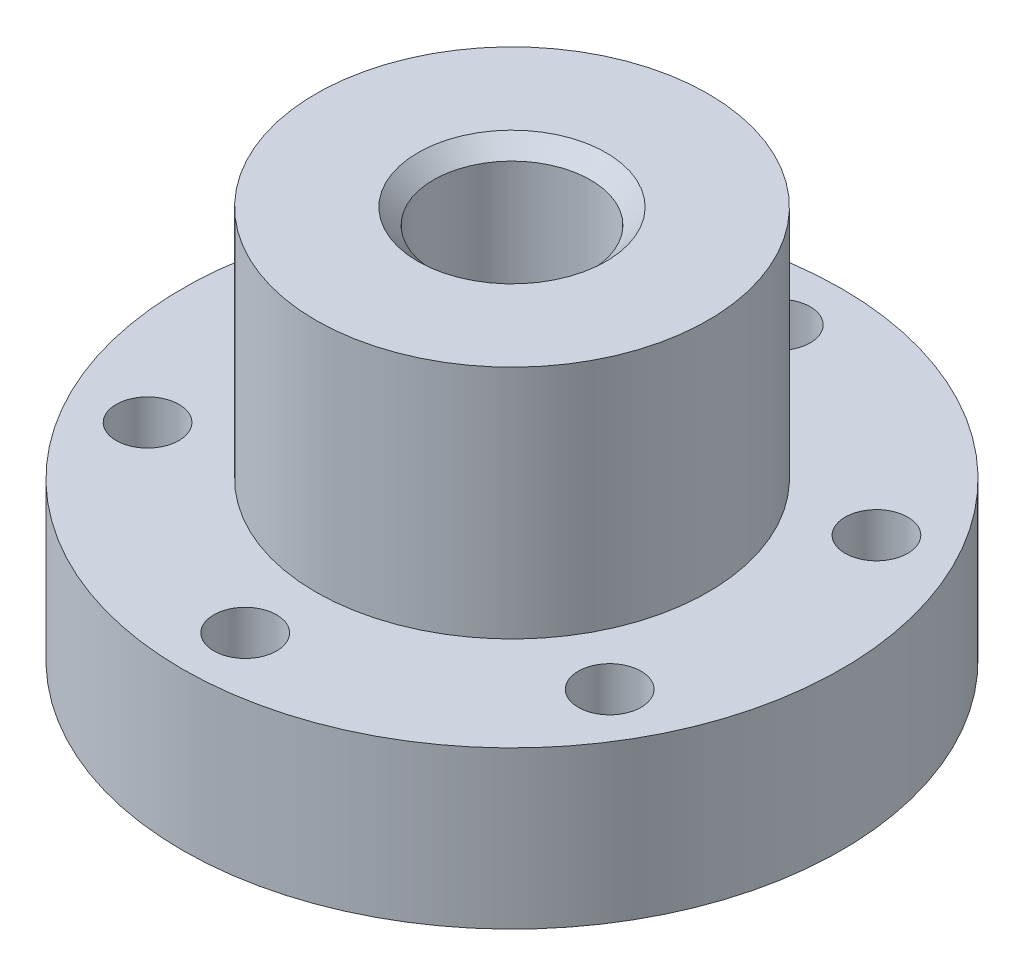
ISO-10303-21;
HEADER;
FILE_DESCRIPTION(('STEP AP214'),'2;1');
FILE_NAME('part.step','',(''),(''),'','','');
FILE_SCHEMA(('AUTOMOTIVE_DESIGN { 1 0 10303 214 1 1 1 1 }'));
ENDSEC;
DATA;
#1=APPLICATION_CONTEXT('core data for automotive mechanical design processes');
#2=APPLICATION_PROTOCOL_DEFINITION('international standard','automotive_design',2000,#1);
#3=PRODUCT_CONTEXT('',#1,'mechanical');
#4=PRODUCT('Part','Part','',(#3));
#5=PRODUCT_RELATED_PRODUCT_CATEGORY('part','',(#4));
#6=PRODUCT_DEFINITION_FORMATION('','',#4);
#7=PRODUCT_DEFINITION_CONTEXT('part definition',#1,'design');
#8=PRODUCT_DEFINITION('design','',#6,#7);
#9=PRODUCT_DEFINITION_SHAPE('','',#8);
#10=(LENGTH_UNIT() NAMED_UNIT(*) SI_UNIT(.MILLI.,.METRE.));
#11=(NAMED_UNIT(*) PLANE_ANGLE_UNIT() SI_UNIT($,.RADIAN.));
#12=(NAMED_UNIT(*) SI_UNIT($,.STERADIAN.) SOLID_ANGLE_UNIT());
#13=UNCERTAINTY_MEASURE_WITH_UNIT(LENGTH_MEASURE(1.E-05),#10,'distance_accuracy_value','');
#14=(GEOMETRIC_REPRESENTATION_CONTEXT(3) GLOBAL_UNCERTAINTY_ASSIGNED_CONTEXT((#13)) GLOBAL_UNIT_ASSIGNED_CONTEXT((#10,
#11,#12)) REPRESENTATION_CONTEXT('',''));
#15=CARTESIAN_POINT('',(0.,0.,0.));
#16=DIRECTION('',(0.,0.,1.));
#17=DIRECTION('',(1.,0.,0.));
#18=AXIS2_PLACEMENT_3D('',#15,#16,#17);
#19=CARTESIAN_POINT('',(0.,10.,0.));
#20=DIRECTION('',(0.,1.,0.));
#21=DIRECTION('',(0.,0.,1.));
#22=AXIS2_PLACEMENT_3D('',#19,#20,#21);
#23=PLANE('',#22);
#24=CARTESIAN_POINT('',(0.,10.,0.));
#25=DIRECTION('',(0.,1.,0.));
#26=DIRECTION('',(0.,0.,1.));
#27=AXIS2_PLACEMENT_3D('',#24,#25,#26);
#28=CIRCLE('',#27,12.5);
#29=CARTESIAN_POINT('',(0.,10.,12.5));
#30=VERTEX_POINT('',#29);
#31=EDGE_CURVE('E121',#30,#30,#28,.T.);
#32=ORIENTED_EDGE('',*,*,#31,.F.);
#33=EDGE_LOOP('',(#32));
#34=FACE_BOUND('',#33,.T.);
#35=CARTESIAN_POINT('',(-14.7224318643355,10.,8.50000000000001));
#36=DIRECTION('',(0.,1.,0.));
#37=DIRECTION('',(0.,0.,1.));
#38=AXIS2_PLACEMENT_3D('',#35,#36,#37);
#39=CIRCLE('',#38,2.);
#40=CARTESIAN_POINT('',(-14.7224318643355,10.,10.5));
#41=VERTEX_POINT('',#40);
#42=EDGE_CURVE('E101',#41,#41,#39,.T.);
#43=ORIENTED_EDGE('',*,*,#42,.F.);
#44=EDGE_LOOP('',(#43));
#45=FACE_BOUND('',#44,.T.);
#46=CARTESIAN_POINT('',(14.7224318643355,10.,8.5));
#47=DIRECTION('',(0.,1.,0.));
#48=DIRECTION('',(0.,0.,1.));
#49=AXIS2_PLACEMENT_3D('',#46,#47,#48);
#50=CIRCLE('',#49,2.);
#51=CARTESIAN_POINT('',(14.7224318643355,10.,10.5));
#52=VERTEX_POINT('',#51);
#53=EDGE_CURVE('E85',#52,#52,#50,.T.);
#54=ORIENTED_EDGE('',*,*,#53,.F.);
#55=EDGE_LOOP('',(#54));
#56=FACE_BOUND('',#55,.T.);
#57=CARTESIAN_POINT('',(0.,10.,-17.));
#58=DIRECTION('',(0.,1.,0.));
#59=DIRECTION('',(0.,0.,1.));
#60=AXIS2_PLACEMENT_3D('',#57,#58,#59);
#61=CIRCLE('',#60,2.);
#62=CARTESIAN_POINT('',(0.,10.,-15.));
#63=VERTEX_POINT('',#62);
#64=EDGE_CURVE('E69',#63,#63,#61,.T.);
#65=ORIENTED_EDGE('',*,*,#64,.F.);
#66=EDGE_LOOP('',(#65));
#67=FACE_BOUND('',#66,.T.);
#68=CARTESIAN_POINT('',(0.,10.,0.));
#69=DIRECTION('',(0.,1.,0.));
#70=DIRECTION('',(0.,0.,1.));
#71=AXIS2_PLACEMENT_3D('',#68,#69,#70);
#72=CIRCLE('',#71,21.);
#73=CARTESIAN_POINT('',(0.,10.,21.));
#74=VERTEX_POINT('',#73);
#75=EDGE_CURVE('E64',#74,#74,#72,.T.);
#76=ORIENTED_EDGE('',*,*,#75,.T.);
#77=EDGE_LOOP('',(#76));
#78=FACE_BOUND('',#77,.T.);
#79=CARTESIAN_POINT('',(14.7224318643355,10.,-8.5));
#80=DIRECTION('',(0.,1.,0.));
#81=DIRECTION('',(0.,0.,1.));
#82=AXIS2_PLACEMENT_3D('',#79,#80,#81);
#83=CIRCLE('',#82,2.);
#84=CARTESIAN_POINT('',(14.7224318643355,10.,-6.5));
#85=VERTEX_POINT('',#84);
#86=EDGE_CURVE('E77',#85,#85,#83,.T.);
#87=ORIENTED_EDGE('',*,*,#86,.F.);
#88=EDGE_LOOP('',(#87));
#89=FACE_BOUND('',#88,.T.);
#90=CARTESIAN_POINT('',(0.,10.,17.));
#91=DIRECTION('',(0.,1.,0.));
#92=DIRECTION('',(0.,0.,1.));
#93=AXIS2_PLACEMENT_3D('',#90,#91,#92);
#94=CIRCLE('',#93,2.);
#95=CARTESIAN_POINT('',(0.,10.,19.));
#96=VERTEX_POINT('',#95);
#97=EDGE_CURVE('E93',#96,#96,#94,.T.);
#98=ORIENTED_EDGE('',*,*,#97,.F.);
#99=EDGE_LOOP('',(#98));
#100=FACE_BOUND('',#99,.T.);
#101=CARTESIAN_POINT('',(-14.7224318643355,10.,-8.49999999999999));
#102=DIRECTION('',(0.,1.,0.));
#103=DIRECTION('',(0.,0.,1.));
#104=AXIS2_PLACEMENT_3D('',#101,#102,#103);
#105=CIRCLE('',#104,2.);
#106=CARTESIAN_POINT('',(-14.7224318643355,10.,-6.49999999999999));
#107=VERTEX_POINT('',#106);
#108=EDGE_CURVE('E109',#107,#107,#105,.T.);
#109=ORIENTED_EDGE('',*,*,#108,.F.);
#110=EDGE_LOOP('',(#109));
#111=FACE_BOUND('',#110,.T.);
#112=ADVANCED_FACE('F39',(#34,#45,#56,#67,#78,#89,#100,#111),#23,.T.);
#113=CARTESIAN_POINT('',(0.,0.,0.));
#114=DIRECTION('',(0.,1.,0.));
#115=DIRECTION('',(0.,0.,1.));
#116=AXIS2_PLACEMENT_3D('',#113,#114,#115);
#117=PLANE('',#116);
#118=CARTESIAN_POINT('',(0.,0.,0.));
#119=DIRECTION('',(0.,1.,0.));
#120=DIRECTION('',(0.,0.,1.));
#121=AXIS2_PLACEMENT_3D('',#118,#119,#120);
#122=CIRCLE('',#121,6.);
#123=CARTESIAN_POINT('',(0.,0.,6.));
#124=VERTEX_POINT('',#123);
#125=EDGE_CURVE('E58',#124,#124,#122,.T.);
#126=ORIENTED_EDGE('',*,*,#125,.T.);
#127=EDGE_LOOP('',(#126));
#128=FACE_BOUND('',#127,.T.);
#129=CARTESIAN_POINT('',(0.,0.,0.));
#130=DIRECTION('',(0.,1.,0.));
#131=DIRECTION('',(0.,0.,1.));
#132=AXIS2_PLACEMENT_3D('',#129,#130,#131);
#133=CIRCLE('',#132,21.);
#134=CARTESIAN_POINT('',(0.,0.,21.));
#135=VERTEX_POINT('',#134);
#136=EDGE_CURVE('E65',#135,#135,#133,.T.);
#137=ORIENTED_EDGE('',*,*,#136,.F.);
#138=EDGE_LOOP('',(#137));
#139=FACE_BOUND('',#138,.T.);
#140=CARTESIAN_POINT('',(0.,0.,-17.));
#141=DIRECTION('',(0.,1.,0.));
#142=DIRECTION('',(0.,0.,1.));
#143=AXIS2_PLACEMENT_3D('',#140,#141,#142);
#144=CIRCLE('',#143,2.);
#145=CARTESIAN_POINT('',(0.,0.,-15.));
#146=VERTEX_POINT('',#145);
#147=EDGE_CURVE('E73',#146,#146,#144,.T.);
#148=ORIENTED_EDGE('',*,*,#147,.T.);
#149=EDGE_LOOP('',(#148));
#150=FACE_BOUND('',#149,.T.);
#151=CARTESIAN_POINT('',(14.7224318643355,0.,-8.5));
#152=DIRECTION('',(0.,1.,0.));
#153=DIRECTION('',(0.,0.,1.));
#154=AXIS2_PLACEMENT_3D('',#151,#152,#153);
#155=CIRCLE('',#154,2.);
#156=CARTESIAN_POINT('',(14.7224318643355,0.,-6.5));
#157=VERTEX_POINT('',#156);
#158=EDGE_CURVE('E81',#157,#157,#155,.T.);
#159=ORIENTED_EDGE('',*,*,#158,.T.);
#160=EDGE_LOOP('',(#159));
#161=FACE_BOUND('',#160,.T.);
#162=CARTESIAN_POINT('',(14.7224318643355,0.,8.5));
#163=DIRECTION('',(0.,1.,0.));
#164=DIRECTION('',(0.,0.,1.));
#165=AXIS2_PLACEMENT_3D('',#162,#163,#164);
#166=CIRCLE('',#165,2.);
#167=CARTESIAN_POINT('',(14.7224318643355,0.,10.5));
#168=VERTEX_POINT('',#167);
#169=EDGE_CURVE('E89',#168,#168,#166,.T.);
#170=ORIENTED_EDGE('',*,*,#169,.T.);
#171=EDGE_LOOP('',(#170));
#172=FACE_BOUND('',#171,.T.);
#173=CARTESIAN_POINT('',(0.,0.,17.));
#174=DIRECTION('',(0.,1.,0.));
#175=DIRECTION('',(0.,0.,1.));
#176=AXIS2_PLACEMENT_3D('',#173,#174,#175);
#177=CIRCLE('',#176,2.);
#178=CARTESIAN_POINT('',(0.,0.,19.));
#179=VERTEX_POINT('',#178);
#180=EDGE_CURVE('E97',#179,#179,#177,.T.);
#181=ORIENTED_EDGE('',*,*,#180,.T.);
#182=EDGE_LOOP('',(#181));
#183=FACE_BOUND('',#182,.T.);
#184=CARTESIAN_POINT('',(-14.7224318643355,0.,8.50000000000001));
#185=DIRECTION('',(0.,1.,0.));
#186=DIRECTION('',(0.,0.,1.));
#187=AXIS2_PLACEMENT_3D('',#184,#185,#186);
#188=CIRCLE('',#187,2.);
#189=CARTESIAN_POINT('',(-14.7224318643355,0.,10.5));
#190=VERTEX_POINT('',#189);
#191=EDGE_CURVE('E105',#190,#190,#188,.T.);
#192=ORIENTED_EDGE('',*,*,#191,.T.);
#193=EDGE_LOOP('',(#192));
#194=FACE_BOUND('',#193,.T.);
#195=CARTESIAN_POINT('',(-14.7224318643355,0.,-8.49999999999999));
#196=DIRECTION('',(0.,1.,0.));
#197=DIRECTION('',(0.,0.,1.));
#198=AXIS2_PLACEMENT_3D('',#195,#196,#197);
#199=CIRCLE('',#198,2.);
#200=CARTESIAN_POINT('',(-14.7224318643355,0.,-6.49999999999999));
#201=VERTEX_POINT('',#200);
#202=EDGE_CURVE('E113',#201,#201,#199,.T.);
#203=ORIENTED_EDGE('',*,*,#202,.T.);
#204=EDGE_LOOP('',(#203));
#205=FACE_BOUND('',#204,.T.);
#206=ADVANCED_FACE('F140',(#128,#139,#150,#161,#172,#183,#194,#205),#117,.F.);
#207=CARTESIAN_POINT('',(0.,10.,0.));
#208=DIRECTION('',(0.,-1.,0.));
#209=DIRECTION('',(0.,0.,-1.));
#210=AXIS2_PLACEMENT_3D('',#207,#208,#209);
#211=CYLINDRICAL_SURFACE('',#210,21.);
#212=ORIENTED_EDGE('',*,*,#75,.F.);
#213=EDGE_LOOP('',(#212));
#214=FACE_BOUND('',#213,.T.);
#215=ORIENTED_EDGE('',*,*,#136,.T.);
#216=EDGE_LOOP('',(#215));
#217=FACE_BOUND('',#216,.T.);
#218=ADVANCED_FACE('F163',(#214,#217),#211,.T.);
#219=CARTESIAN_POINT('',(0.,10.,-17.));
#220=DIRECTION('',(0.,-1.,0.));
#221=DIRECTION('',(0.,0.,-1.));
#222=AXIS2_PLACEMENT_3D('',#219,#220,#221);
#223=CYLINDRICAL_SURFACE('',#222,2.);
#224=ORIENTED_EDGE('',*,*,#64,.T.);
#225=EDGE_LOOP('',(#224));
#226=FACE_BOUND('',#225,.T.);
#227=ORIENTED_EDGE('',*,*,#147,.F.);
#228=EDGE_LOOP('',(#227));
#229=FACE_BOUND('',#228,.T.);
#230=ADVANCED_FACE('F169',(#226,#229),#223,.F.);
#231=CARTESIAN_POINT('',(14.7224318643355,10.,-8.5));
#232=DIRECTION('',(0.,-1.,0.));
#233=DIRECTION('',(0.,0.,-1.));
#234=AXIS2_PLACEMENT_3D('',#231,#232,#233);
#235=CYLINDRICAL_SURFACE('',#234,2.);
#236=ORIENTED_EDGE('',*,*,#86,.T.);
#237=EDGE_LOOP('',(#236));
#238=FACE_BOUND('',#237,.T.);
#239=ORIENTED_EDGE('',*,*,#158,.F.);
#240=EDGE_LOOP('',(#239));
#241=FACE_BOUND('',#240,.T.);
#242=ADVANCED_FACE('F205',(#238,#241),#235,.F.);
#243=CARTESIAN_POINT('',(14.7224318643355,10.,8.5));
#244=DIRECTION('',(0.,-1.,0.));
#245=DIRECTION('',(0.,0.,-1.));
#246=AXIS2_PLACEMENT_3D('',#243,#244,#245);
#247=CYLINDRICAL_SURFACE('',#246,2.);
#248=ORIENTED_EDGE('',*,*,#53,.T.);
#249=EDGE_LOOP('',(#248));
#250=FACE_BOUND('',#249,.T.);
#251=ORIENTED_EDGE('',*,*,#169,.F.);
#252=EDGE_LOOP('',(#251));
#253=FACE_BOUND('',#252,.T.);
#254=ADVANCED_FACE('F201',(#250,#253),#247,.F.);
#255=CARTESIAN_POINT('',(0.,10.,17.));
#256=DIRECTION('',(0.,-1.,0.));
#257=DIRECTION('',(0.,0.,-1.));
#258=AXIS2_PLACEMENT_3D('',#255,#256,#257);
#259=CYLINDRICAL_SURFACE('',#258,2.);
#260=ORIENTED_EDGE('',*,*,#97,.T.);
#261=EDGE_LOOP('',(#260));
#262=FACE_BOUND('',#261,.T.);
#263=ORIENTED_EDGE('',*,*,#180,.F.);
#264=EDGE_LOOP('',(#263));
#265=FACE_BOUND('',#264,.T.);
#266=ADVANCED_FACE('F197',(#262,#265),#259,.F.);
#267=CARTESIAN_POINT('',(-14.7224318643355,10.,8.50000000000001));
#268=DIRECTION('',(0.,-1.,0.));
#269=DIRECTION('',(0.,0.,-1.));
#270=AXIS2_PLACEMENT_3D('',#267,#268,#269);
#271=CYLINDRICAL_SURFACE('',#270,2.);
#272=ORIENTED_EDGE('',*,*,#42,.T.);
#273=EDGE_LOOP('',(#272));
#274=FACE_BOUND('',#273,.T.);
#275=ORIENTED_EDGE('',*,*,#191,.F.);
#276=EDGE_LOOP('',(#275));
#277=FACE_BOUND('',#276,.T.);
#278=ADVANCED_FACE('F158',(#274,#277),#271,.F.);
#279=CARTESIAN_POINT('',(-14.7224318643355,10.,-8.49999999999999));
#280=DIRECTION('',(0.,-1.,0.));
#281=DIRECTION('',(0.,0.,-1.));
#282=AXIS2_PLACEMENT_3D('',#279,#280,#281);
#283=CYLINDRICAL_SURFACE('',#282,2.);
#284=ORIENTED_EDGE('',*,*,#108,.T.);
#285=EDGE_LOOP('',(#284));
#286=FACE_BOUND('',#285,.T.);
#287=ORIENTED_EDGE('',*,*,#202,.F.);
#288=EDGE_LOOP('',(#287));
#289=FACE_BOUND('',#288,.T.);
#290=ADVANCED_FACE('F134',(#286,#289),#283,.F.);
#291=CARTESIAN_POINT('',(0.,25.,0.));
#292=DIRECTION('',(0.,-1.,0.));
#293=DIRECTION('',(0.,0.,-1.));
#294=AXIS2_PLACEMENT_3D('',#291,#292,#293);
#295=CYLINDRICAL_SURFACE('',#294,12.5);
#296=CARTESIAN_POINT('',(0.,25.,0.));
#297=DIRECTION('',(0.,1.,0.));
#298=DIRECTION('',(0.,0.,1.));
#299=AXIS2_PLACEMENT_3D('',#296,#297,#298);
#300=CIRCLE('',#299,12.5);
#301=CARTESIAN_POINT('',(0.,25.,12.5));
#302=VERTEX_POINT('',#301);
#303=EDGE_CURVE('E117',#302,#302,#300,.T.);
#304=ORIENTED_EDGE('',*,*,#303,.F.);
#305=EDGE_LOOP('',(#304));
#306=FACE_BOUND('',#305,.T.);
#307=ORIENTED_EDGE('',*,*,#31,.T.);
#308=EDGE_LOOP('',(#307));
#309=FACE_BOUND('',#308,.T.);
#310=ADVANCED_FACE('F131',(#306,#309),#295,.T.);
#311=CARTESIAN_POINT('',(0.,25.,0.));
#312=DIRECTION('',(0.,1.,0.));
#313=DIRECTION('',(0.,0.,1.));
#314=AXIS2_PLACEMENT_3D('',#311,#312,#313);
#315=PLANE('',#314);
#316=CARTESIAN_POINT('',(0.,25.,0.));
#317=DIRECTION('',(0.,1.,0.));
#318=DIRECTION('',(0.,0.,1.));
#319=AXIS2_PLACEMENT_3D('',#316,#317,#318);
#320=CIRCLE('',#319,6.00000000000001);
#321=CARTESIAN_POINT('',(0.,25.,6.00000000000001));
#322=VERTEX_POINT('',#321);
#323=EDGE_CURVE('E10',#322,#322,#320,.F.);
#324=ORIENTED_EDGE('',*,*,#323,.T.);
#325=EDGE_LOOP('',(#324));
#326=FACE_BOUND('',#325,.T.);
#327=ORIENTED_EDGE('',*,*,#303,.T.);
#328=EDGE_LOOP('',(#327));
#329=FACE_BOUND('',#328,.T.);
#330=ADVANCED_FACE('F129',(#326,#329),#315,.T.);
#331=CARTESIAN_POINT('',(0.,0.,0.));
#332=DIRECTION('',(0.,1.,0.));
#333=DIRECTION('',(0.,0.,1.));
#334=AXIS2_PLACEMENT_3D('',#331,#332,#333);
#335=CYLINDRICAL_SURFACE('',#334,5.);
#336=CARTESIAN_POINT('',(0.,1.,0.));
#337=DIRECTION('',(0.,1.,0.));
#338=DIRECTION('',(0.,0.,1.));
#339=AXIS2_PLACEMENT_3D('',#336,#337,#338);
#340=CIRCLE('',#339,5.);
#341=CARTESIAN_POINT('',(0.,1.,5.));
#342=VERTEX_POINT('',#341);
#343=EDGE_CURVE('E48',#342,#342,#340,.F.);
#344=ORIENTED_EDGE('',*,*,#343,.T.);
#345=EDGE_LOOP('',(#344));
#346=FACE_BOUND('',#345,.T.);
#347=CARTESIAN_POINT('',(0.,24.,0.));
#348=DIRECTION('',(0.,1.,0.));
#349=DIRECTION('',(0.,0.,1.));
#350=AXIS2_PLACEMENT_3D('',#347,#348,#349);
#351=CIRCLE('',#350,5.);
#352=CARTESIAN_POINT('',(0.,24.,5.));
#353=VERTEX_POINT('',#352);
#354=EDGE_CURVE('E53',#353,#353,#351,.T.);
#355=ORIENTED_EDGE('',*,*,#354,.T.);
#356=EDGE_LOOP('',(#355));
#357=FACE_BOUND('',#356,.T.);
#358=ADVANCED_FACE('F179',(#346,#357),#335,.F.);
#359=CARTESIAN_POINT('',(0.,0.,0.));
#360=DIRECTION('',(0.,-1.,0.));
#361=DIRECTION('',(0.,0.,-1.));
#362=AXIS2_PLACEMENT_3D('',#359,#360,#361);
#363=CONICAL_SURFACE('',#362,6.,0.785398163397447);
#364=ORIENTED_EDGE('',*,*,#343,.F.);
#365=EDGE_LOOP('',(#364));
#366=FACE_BOUND('',#365,.T.);
#367=ORIENTED_EDGE('',*,*,#125,.F.);
#368=EDGE_LOOP('',(#367));
#369=FACE_BOUND('',#368,.T.);
#370=ADVANCED_FACE('F175',(#366,#369),#363,.F.);
#371=CARTESIAN_POINT('',(0.,24.,0.));
#372=DIRECTION('',(0.,1.,0.));
#373=DIRECTION('',(0.,0.,1.));
#374=AXIS2_PLACEMENT_3D('',#371,#372,#373);
#375=CONICAL_SURFACE('',#374,5.,0.785398163397454);
#376=ORIENTED_EDGE('',*,*,#323,.F.);
#377=EDGE_LOOP('',(#376));
#378=FACE_BOUND('',#377,.T.);
#379=ORIENTED_EDGE('',*,*,#354,.F.);
#380=EDGE_LOOP('',(#379));
#381=FACE_BOUND('',#380,.T.);
#382=ADVANCED_FACE('F42',(#378,#381),#375,.F.);
#383=CLOSED_SHELL('',(#112,#206,#218,#230,#242,#254,#266,#278,#290,#310,#330,#358,#370,#382));
#384=MANIFOLD_SOLID_BREP('B2',#383);
#385=ADVANCED_BREP_SHAPE_REPRESENTATION('',(#18,#384),#14);
#386=SHAPE_DEFINITION_REPRESENTATION(#9,#385);
ENDSEC;
END-ISO-10303-21;
